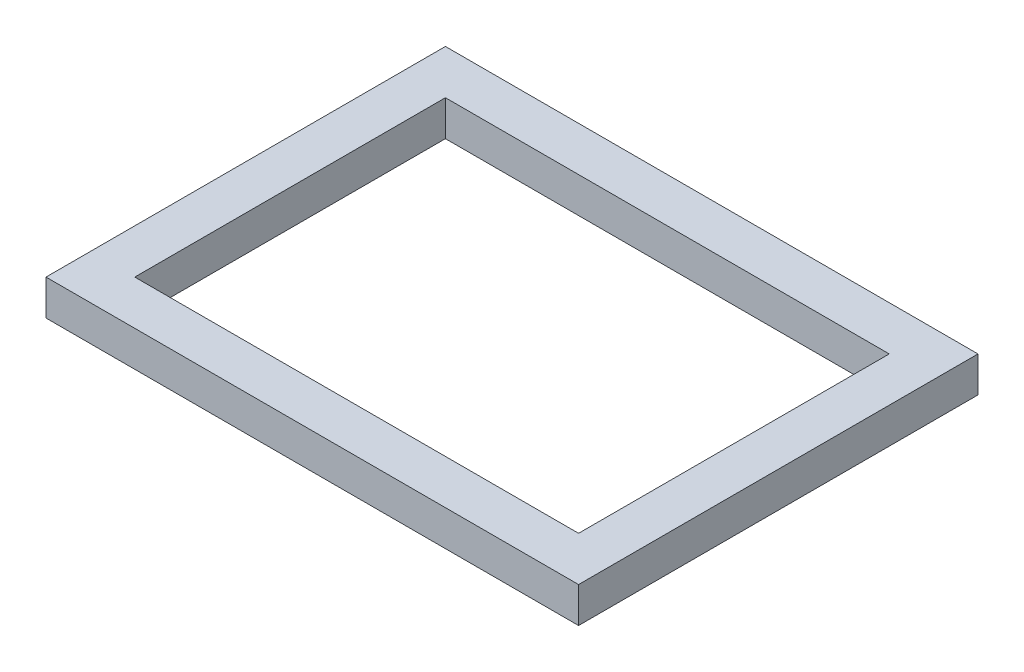
ISO-10303-21;
HEADER;
FILE_DESCRIPTION(('STEP AP214'),'2;1');
FILE_NAME('part.step','',(''),(''),'','','');
FILE_SCHEMA(('AUTOMOTIVE_DESIGN { 1 0 10303 214 1 1 1 1 }'));
ENDSEC;
DATA;
#1=APPLICATION_CONTEXT('core data for automotive mechanical design processes');
#2=APPLICATION_PROTOCOL_DEFINITION('international standard','automotive_design',2000,#1);
#3=PRODUCT_CONTEXT('',#1,'mechanical');
#4=PRODUCT('Part','Part','',(#3));
#5=PRODUCT_RELATED_PRODUCT_CATEGORY('part','',(#4));
#6=PRODUCT_DEFINITION_FORMATION('','',#4);
#7=PRODUCT_DEFINITION_CONTEXT('part definition',#1,'design');
#8=PRODUCT_DEFINITION('design','',#6,#7);
#9=PRODUCT_DEFINITION_SHAPE('','',#8);
#10=(LENGTH_UNIT() NAMED_UNIT(*) SI_UNIT(.MILLI.,.METRE.));
#11=(NAMED_UNIT(*) PLANE_ANGLE_UNIT() SI_UNIT($,.RADIAN.));
#12=(NAMED_UNIT(*) SI_UNIT($,.STERADIAN.) SOLID_ANGLE_UNIT());
#13=UNCERTAINTY_MEASURE_WITH_UNIT(LENGTH_MEASURE(1.E-05),#10,'distance_accuracy_value','');
#14=(GEOMETRIC_REPRESENTATION_CONTEXT(3) GLOBAL_UNCERTAINTY_ASSIGNED_CONTEXT((#13)) GLOBAL_UNIT_ASSIGNED_CONTEXT((#10,
#11,#12)) REPRESENTATION_CONTEXT('',''));
#15=CARTESIAN_POINT('',(0.,0.,0.));
#16=DIRECTION('',(0.,0.,1.));
#17=DIRECTION('',(1.,0.,0.));
#18=AXIS2_PLACEMENT_3D('',#15,#16,#17);
#19=CARTESIAN_POINT('',(0.,2.54,0.));
#20=DIRECTION('',(0.,1.,0.));
#21=DIRECTION('',(0.,0.,1.));
#22=AXIS2_PLACEMENT_3D('',#19,#20,#21);
#23=PLANE('',#22);
#24=DIRECTION('',(0.,0.,-1.));
#25=VECTOR('',#24,1.);
#26=CARTESIAN_POINT('',(19.05,2.54,-14.2875));
#27=LINE('',#26,#25);
#28=CARTESIAN_POINT('',(19.05,2.54,14.2875));
#29=VERTEX_POINT('',#28);
#30=CARTESIAN_POINT('',(19.05,2.54,-14.2875));
#31=VERTEX_POINT('',#30);
#32=EDGE_CURVE('E135',#29,#31,#27,.T.);
#33=ORIENTED_EDGE('',*,*,#32,.T.);
#34=DIRECTION('',(-1.,0.,0.));
#35=VECTOR('',#34,1.);
#36=CARTESIAN_POINT('',(-19.05,2.54,-14.2875));
#37=LINE('',#36,#35);
#38=CARTESIAN_POINT('',(-19.05,2.54,-14.2875));
#39=VERTEX_POINT('',#38);
#40=EDGE_CURVE('E138',#31,#39,#37,.T.);
#41=ORIENTED_EDGE('',*,*,#40,.T.);
#42=DIRECTION('',(0.,0.,1.));
#43=VECTOR('',#42,1.);
#44=CARTESIAN_POINT('',(-19.05,2.54,-14.2875));
#45=LINE('',#44,#43);
#46=CARTESIAN_POINT('',(-19.05,2.54,14.2875));
#47=VERTEX_POINT('',#46);
#48=EDGE_CURVE('E141',#39,#47,#45,.T.);
#49=ORIENTED_EDGE('',*,*,#48,.T.);
#50=DIRECTION('',(1.,0.,0.));
#51=VECTOR('',#50,1.);
#52=CARTESIAN_POINT('',(-19.05,2.54,14.2875));
#53=LINE('',#52,#51);
#54=EDGE_CURVE('E143',#47,#29,#53,.T.);
#55=ORIENTED_EDGE('',*,*,#54,.T.);
#56=EDGE_LOOP('',(#33,#41,#49,#55));
#57=FACE_BOUND('',#56,.T.);
#58=DIRECTION('',(-1.,0.,0.));
#59=VECTOR('',#58,1.);
#60=CARTESIAN_POINT('',(-15.875,2.54,-11.1125));
#61=LINE('',#60,#59);
#62=CARTESIAN_POINT('',(15.875,2.54,-11.1125));
#63=VERTEX_POINT('',#62);
#64=CARTESIAN_POINT('',(-15.875,2.54,-11.1125));
#65=VERTEX_POINT('',#64);
#66=EDGE_CURVE('E107',#63,#65,#61,.T.);
#67=ORIENTED_EDGE('',*,*,#66,.F.);
#68=DIRECTION('',(0.,0.,-1.));
#69=VECTOR('',#68,1.);
#70=CARTESIAN_POINT('',(15.875,2.54,11.1125));
#71=LINE('',#70,#69);
#72=CARTESIAN_POINT('',(15.875,2.54,11.1125));
#73=VERTEX_POINT('',#72);
#74=EDGE_CURVE('E99',#73,#63,#71,.T.);
#75=ORIENTED_EDGE('',*,*,#74,.F.);
#76=DIRECTION('',(1.,0.,0.));
#77=VECTOR('',#76,1.);
#78=CARTESIAN_POINT('',(-15.875,2.54,11.1125));
#79=LINE('',#78,#77);
#80=CARTESIAN_POINT('',(-15.875,2.54,11.1125));
#81=VERTEX_POINT('',#80);
#82=EDGE_CURVE('E121',#81,#73,#79,.T.);
#83=ORIENTED_EDGE('',*,*,#82,.F.);
#84=DIRECTION('',(0.,0.,1.));
#85=VECTOR('',#84,1.);
#86=CARTESIAN_POINT('',(-15.875,2.54,11.1125));
#87=LINE('',#86,#85);
#88=EDGE_CURVE('E119',#65,#81,#87,.T.);
#89=ORIENTED_EDGE('',*,*,#88,.F.);
#90=EDGE_LOOP('',(#67,#75,#83,#89));
#91=FACE_BOUND('',#90,.T.);
#92=ADVANCED_FACE('F34',(#57,#91),#23,.T.);
#93=CARTESIAN_POINT('',(0.,0.,0.));
#94=DIRECTION('',(0.,1.,0.));
#95=DIRECTION('',(0.,0.,1.));
#96=AXIS2_PLACEMENT_3D('',#93,#94,#95);
#97=PLANE('',#96);
#98=DIRECTION('',(0.,0.,-1.));
#99=VECTOR('',#98,1.);
#100=CARTESIAN_POINT('',(19.05,0.,-14.2875));
#101=LINE('',#100,#99);
#102=CARTESIAN_POINT('',(19.05,0.,14.2875));
#103=VERTEX_POINT('',#102);
#104=CARTESIAN_POINT('',(19.05,0.,-14.2875));
#105=VERTEX_POINT('',#104);
#106=EDGE_CURVE('E115',#103,#105,#101,.T.);
#107=ORIENTED_EDGE('',*,*,#106,.F.);
#108=DIRECTION('',(1.,0.,0.));
#109=VECTOR('',#108,1.);
#110=CARTESIAN_POINT('',(-19.05,0.,14.2875));
#111=LINE('',#110,#109);
#112=CARTESIAN_POINT('',(-19.05,0.,14.2875));
#113=VERTEX_POINT('',#112);
#114=EDGE_CURVE('E139',#113,#103,#111,.T.);
#115=ORIENTED_EDGE('',*,*,#114,.F.);
#116=DIRECTION('',(0.,0.,1.));
#117=VECTOR('',#116,1.);
#118=CARTESIAN_POINT('',(-19.05,0.,-14.2875));
#119=LINE('',#118,#117);
#120=CARTESIAN_POINT('',(-19.05,0.,-14.2875));
#121=VERTEX_POINT('',#120);
#122=EDGE_CURVE('E150',#121,#113,#119,.T.);
#123=ORIENTED_EDGE('',*,*,#122,.F.);
#124=DIRECTION('',(-1.,0.,0.));
#125=VECTOR('',#124,1.);
#126=CARTESIAN_POINT('',(-19.05,0.,-14.2875));
#127=LINE('',#126,#125);
#128=EDGE_CURVE('E148',#105,#121,#127,.T.);
#129=ORIENTED_EDGE('',*,*,#128,.F.);
#130=EDGE_LOOP('',(#107,#115,#123,#129));
#131=FACE_BOUND('',#130,.T.);
#132=DIRECTION('',(0.,0.,-1.));
#133=VECTOR('',#132,1.);
#134=CARTESIAN_POINT('',(15.875,0.,11.1125));
#135=LINE('',#134,#133);
#136=CARTESIAN_POINT('',(15.875,0.,11.1125));
#137=VERTEX_POINT('',#136);
#138=CARTESIAN_POINT('',(15.875,0.,-11.1125));
#139=VERTEX_POINT('',#138);
#140=EDGE_CURVE('E57',#137,#139,#135,.T.);
#141=ORIENTED_EDGE('',*,*,#140,.T.);
#142=DIRECTION('',(-1.,0.,0.));
#143=VECTOR('',#142,1.);
#144=CARTESIAN_POINT('',(-15.875,0.,-11.1125));
#145=LINE('',#144,#143);
#146=CARTESIAN_POINT('',(-15.875,0.,-11.1125));
#147=VERTEX_POINT('',#146);
#148=EDGE_CURVE('E114',#139,#147,#145,.T.);
#149=ORIENTED_EDGE('',*,*,#148,.T.);
#150=DIRECTION('',(0.,0.,1.));
#151=VECTOR('',#150,1.);
#152=CARTESIAN_POINT('',(-15.875,0.,11.1125));
#153=LINE('',#152,#151);
#154=CARTESIAN_POINT('',(-15.875,0.,11.1125));
#155=VERTEX_POINT('',#154);
#156=EDGE_CURVE('E127',#147,#155,#153,.T.);
#157=ORIENTED_EDGE('',*,*,#156,.T.);
#158=DIRECTION('',(1.,0.,0.));
#159=VECTOR('',#158,1.);
#160=CARTESIAN_POINT('',(-15.875,0.,11.1125));
#161=LINE('',#160,#159);
#162=EDGE_CURVE('E108',#155,#137,#161,.T.);
#163=ORIENTED_EDGE('',*,*,#162,.T.);
#164=EDGE_LOOP('',(#141,#149,#157,#163));
#165=FACE_BOUND('',#164,.T.);
#166=ADVANCED_FACE('F168',(#131,#165),#97,.F.);
#167=CARTESIAN_POINT('',(19.05,2.54,-14.2875));
#168=DIRECTION('',(-1.,0.,0.));
#169=DIRECTION('',(0.,0.,1.));
#170=AXIS2_PLACEMENT_3D('',#167,#168,#169);
#171=PLANE('',#170);
#172=ORIENTED_EDGE('',*,*,#106,.T.);
#173=DIRECTION('',(0.,-1.,0.));
#174=VECTOR('',#173,1.);
#175=CARTESIAN_POINT('',(19.05,2.54,-14.2875));
#176=LINE('',#175,#174);
#177=EDGE_CURVE('E11',#31,#105,#176,.T.);
#178=ORIENTED_EDGE('',*,*,#177,.F.);
#179=ORIENTED_EDGE('',*,*,#32,.F.);
#180=DIRECTION('',(0.,-1.,0.));
#181=VECTOR('',#180,1.);
#182=CARTESIAN_POINT('',(19.05,2.54,14.2875));
#183=LINE('',#182,#181);
#184=EDGE_CURVE('E145',#29,#103,#183,.T.);
#185=ORIENTED_EDGE('',*,*,#184,.T.);
#186=EDGE_LOOP('',(#172,#178,#179,#185));
#187=FACE_BOUND('',#186,.T.);
#188=ADVANCED_FACE('F36',(#187),#171,.F.);
#189=CARTESIAN_POINT('',(-19.05,2.54,-14.2875));
#190=DIRECTION('',(0.,0.,1.));
#191=DIRECTION('',(1.,0.,0.));
#192=AXIS2_PLACEMENT_3D('',#189,#190,#191);
#193=PLANE('',#192);
#194=ORIENTED_EDGE('',*,*,#128,.T.);
#195=DIRECTION('',(0.,-1.,0.));
#196=VECTOR('',#195,1.);
#197=CARTESIAN_POINT('',(-19.05,2.54,-14.2875));
#198=LINE('',#197,#196);
#199=EDGE_CURVE('E42',#39,#121,#198,.T.);
#200=ORIENTED_EDGE('',*,*,#199,.F.);
#201=ORIENTED_EDGE('',*,*,#40,.F.);
#202=ORIENTED_EDGE('',*,*,#177,.T.);
#203=EDGE_LOOP('',(#194,#200,#201,#202));
#204=FACE_BOUND('',#203,.T.);
#205=ADVANCED_FACE('F178',(#204),#193,.F.);
#206=CARTESIAN_POINT('',(-19.05,2.54,-14.2875));
#207=DIRECTION('',(1.,0.,0.));
#208=DIRECTION('',(0.,0.,-1.));
#209=AXIS2_PLACEMENT_3D('',#206,#207,#208);
#210=PLANE('',#209);
#211=ORIENTED_EDGE('',*,*,#122,.T.);
#212=DIRECTION('',(0.,-1.,0.));
#213=VECTOR('',#212,1.);
#214=CARTESIAN_POINT('',(-19.05,2.54,14.2875));
#215=LINE('',#214,#213);
#216=EDGE_CURVE('E155',#47,#113,#215,.T.);
#217=ORIENTED_EDGE('',*,*,#216,.F.);
#218=ORIENTED_EDGE('',*,*,#48,.F.);
#219=ORIENTED_EDGE('',*,*,#199,.T.);
#220=EDGE_LOOP('',(#211,#217,#218,#219));
#221=FACE_BOUND('',#220,.T.);
#222=ADVANCED_FACE('F162',(#221),#210,.F.);
#223=CARTESIAN_POINT('',(-19.05,2.54,14.2875));
#224=DIRECTION('',(0.,0.,-1.));
#225=DIRECTION('',(-1.,0.,0.));
#226=AXIS2_PLACEMENT_3D('',#223,#224,#225);
#227=PLANE('',#226);
#228=ORIENTED_EDGE('',*,*,#114,.T.);
#229=ORIENTED_EDGE('',*,*,#184,.F.);
#230=ORIENTED_EDGE('',*,*,#54,.F.);
#231=ORIENTED_EDGE('',*,*,#216,.T.);
#232=EDGE_LOOP('',(#228,#229,#230,#231));
#233=FACE_BOUND('',#232,.T.);
#234=ADVANCED_FACE('F172',(#233),#227,.F.);
#235=CARTESIAN_POINT('',(15.875,2.54,11.1125));
#236=DIRECTION('',(-1.,0.,0.));
#237=DIRECTION('',(0.,0.,1.));
#238=AXIS2_PLACEMENT_3D('',#235,#236,#237);
#239=PLANE('',#238);
#240=ORIENTED_EDGE('',*,*,#140,.F.);
#241=DIRECTION('',(0.,-1.,0.));
#242=VECTOR('',#241,1.);
#243=CARTESIAN_POINT('',(15.875,2.54,11.1125));
#244=LINE('',#243,#242);
#245=EDGE_CURVE('E103',#73,#137,#244,.T.);
#246=ORIENTED_EDGE('',*,*,#245,.F.);
#247=ORIENTED_EDGE('',*,*,#74,.T.);
#248=DIRECTION('',(0.,-1.,0.));
#249=VECTOR('',#248,1.);
#250=CARTESIAN_POINT('',(15.875,2.54,-11.1125));
#251=LINE('',#250,#249);
#252=EDGE_CURVE('E102',#63,#139,#251,.T.);
#253=ORIENTED_EDGE('',*,*,#252,.T.);
#254=EDGE_LOOP('',(#240,#246,#247,#253));
#255=FACE_BOUND('',#254,.T.);
#256=ADVANCED_FACE('F101',(#255),#239,.T.);
#257=CARTESIAN_POINT('',(-15.875,2.54,-11.1125));
#258=DIRECTION('',(0.,0.,1.));
#259=DIRECTION('',(1.,0.,0.));
#260=AXIS2_PLACEMENT_3D('',#257,#258,#259);
#261=PLANE('',#260);
#262=ORIENTED_EDGE('',*,*,#148,.F.);
#263=ORIENTED_EDGE('',*,*,#252,.F.);
#264=ORIENTED_EDGE('',*,*,#66,.T.);
#265=DIRECTION('',(0.,-1.,0.));
#266=VECTOR('',#265,1.);
#267=CARTESIAN_POINT('',(-15.875,2.54,-11.1125));
#268=LINE('',#267,#266);
#269=EDGE_CURVE('E116',#65,#147,#268,.T.);
#270=ORIENTED_EDGE('',*,*,#269,.T.);
#271=EDGE_LOOP('',(#262,#263,#264,#270));
#272=FACE_BOUND('',#271,.T.);
#273=ADVANCED_FACE('F111',(#272),#261,.T.);
#274=CARTESIAN_POINT('',(-15.875,2.54,11.1125));
#275=DIRECTION('',(1.,0.,0.));
#276=DIRECTION('',(0.,0.,-1.));
#277=AXIS2_PLACEMENT_3D('',#274,#275,#276);
#278=PLANE('',#277);
#279=ORIENTED_EDGE('',*,*,#156,.F.);
#280=ORIENTED_EDGE('',*,*,#269,.F.);
#281=ORIENTED_EDGE('',*,*,#88,.T.);
#282=DIRECTION('',(0.,-1.,0.));
#283=VECTOR('',#282,1.);
#284=CARTESIAN_POINT('',(-15.875,2.54,11.1125));
#285=LINE('',#284,#283);
#286=EDGE_CURVE('E49',#81,#155,#285,.T.);
#287=ORIENTED_EDGE('',*,*,#286,.T.);
#288=EDGE_LOOP('',(#279,#280,#281,#287));
#289=FACE_BOUND('',#288,.T.);
#290=ADVANCED_FACE('F201',(#289),#278,.T.);
#291=CARTESIAN_POINT('',(-15.875,2.54,11.1125));
#292=DIRECTION('',(0.,0.,-1.));
#293=DIRECTION('',(-1.,0.,0.));
#294=AXIS2_PLACEMENT_3D('',#291,#292,#293);
#295=PLANE('',#294);
#296=ORIENTED_EDGE('',*,*,#162,.F.);
#297=ORIENTED_EDGE('',*,*,#286,.F.);
#298=ORIENTED_EDGE('',*,*,#82,.T.);
#299=ORIENTED_EDGE('',*,*,#245,.T.);
#300=EDGE_LOOP('',(#296,#297,#298,#299));
#301=FACE_BOUND('',#300,.T.);
#302=ADVANCED_FACE('F205',(#301),#295,.T.);
#303=CLOSED_SHELL('',(#92,#166,#188,#205,#222,#234,#256,#273,#290,#302));
#304=MANIFOLD_SOLID_BREP('B2',#303);
#305=ADVANCED_BREP_SHAPE_REPRESENTATION('',(#18,#304),#14);
#306=SHAPE_DEFINITION_REPRESENTATION(#9,#305);
ENDSEC;
END-ISO-10303-21;
